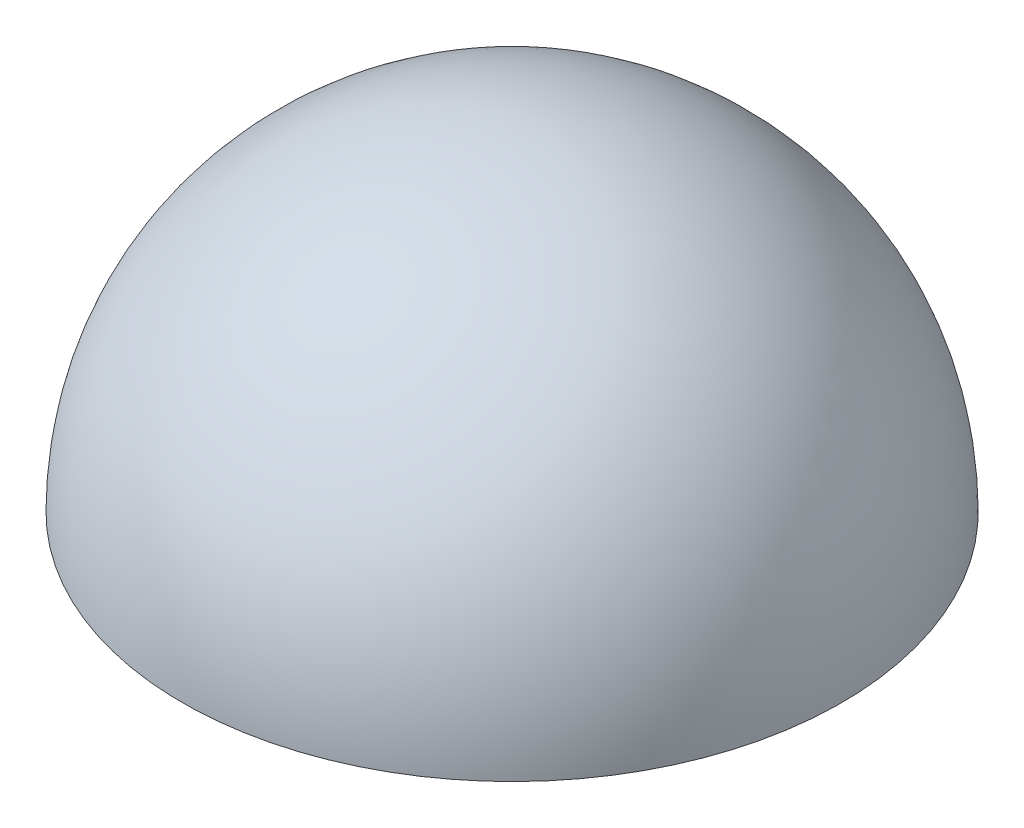
ISO-10303-21;
HEADER;
FILE_DESCRIPTION(('STEP AP214'),'2;1');
FILE_NAME('part.step','',(''),(''),'','','');
FILE_SCHEMA(('AUTOMOTIVE_DESIGN { 1 0 10303 214 1 1 1 1 }'));
ENDSEC;
DATA;
#1=APPLICATION_CONTEXT('core data for automotive mechanical design processes');
#2=APPLICATION_PROTOCOL_DEFINITION('international standard','automotive_design',2000,#1);
#3=PRODUCT_CONTEXT('',#1,'mechanical');
#4=PRODUCT('Part','Part','',(#3));
#5=PRODUCT_RELATED_PRODUCT_CATEGORY('part','',(#4));
#6=PRODUCT_DEFINITION_FORMATION('','',#4);
#7=PRODUCT_DEFINITION_CONTEXT('part definition',#1,'design');
#8=PRODUCT_DEFINITION('design','',#6,#7);
#9=PRODUCT_DEFINITION_SHAPE('','',#8);
#10=(LENGTH_UNIT() NAMED_UNIT(*) SI_UNIT(.MILLI.,.METRE.));
#11=(NAMED_UNIT(*) PLANE_ANGLE_UNIT() SI_UNIT($,.RADIAN.));
#12=(NAMED_UNIT(*) SI_UNIT($,.STERADIAN.) SOLID_ANGLE_UNIT());
#13=UNCERTAINTY_MEASURE_WITH_UNIT(LENGTH_MEASURE(1.E-05),#10,'distance_accuracy_value','');
#14=(GEOMETRIC_REPRESENTATION_CONTEXT(3) GLOBAL_UNCERTAINTY_ASSIGNED_CONTEXT((#13)) GLOBAL_UNIT_ASSIGNED_CONTEXT((#10,
#11,#12)) REPRESENTATION_CONTEXT('',''));
#15=CARTESIAN_POINT('',(0.,0.,0.));
#16=DIRECTION('',(0.,0.,1.));
#17=DIRECTION('',(1.,0.,0.));
#18=AXIS2_PLACEMENT_3D('',#15,#16,#17);
#19=CARTESIAN_POINT('',(0.,0.,47.));
#20=DIRECTION('',(0.,0.,-1.));
#21=DIRECTION('',(-1.,0.,0.));
#22=AXIS2_PLACEMENT_3D('',#19,#20,#21);
#23=SPHERICAL_SURFACE('',#22,47.);
#24=CARTESIAN_POINT('',(0.,0.,47.));
#25=DIRECTION('',(0.,-1.,0.));
#26=DIRECTION('',(0.,0.,-1.));
#27=AXIS2_PLACEMENT_3D('',#24,#25,#26);
#28=SPHERICAL_SURFACE('',#27,47.);
#29=CARTESIAN_POINT('',(0.,0.,47.));
#30=DIRECTION('',(0.,-1.,0.));
#31=DIRECTION('',(0.,0.,-1.));
#32=AXIS2_PLACEMENT_3D('',#29,#30,#31);
#33=CIRCLE('',#32,47.);
#34=CARTESIAN_POINT('',(0.,0.,0.));
#35=VERTEX_POINT('',#34);
#36=EDGE_CURVE('E10',#35,#35,#33,.T.);
#37=ORIENTED_EDGE('',*,*,#36,.F.);
#38=EDGE_LOOP('',(#37));
#39=FACE_BOUND('',#38,.T.);
#40=ADVANCED_FACE('F35',(#39),#28,.T.);
#41=CARTESIAN_POINT('',(0.,0.,47.));
#42=DIRECTION('',(0.,1.,0.));
#43=DIRECTION('',(0.,0.,-1.));
#44=AXIS2_PLACEMENT_3D('',#41,#42,#43);
#45=PLANE('',#44);
#46=CARTESIAN_POINT('',(0.,0.,47.));
#47=DIRECTION('',(0.,1.,0.));
#48=DIRECTION('',(-1.,0.,0.));
#49=AXIS2_PLACEMENT_3D('',#46,#47,#48);
#50=CIRCLE('',#49,44.);
#51=CARTESIAN_POINT('',(-43.9999999999999,-3.07250357818195E-13,47.));
#52=VERTEX_POINT('',#51);
#53=EDGE_CURVE('E41',#52,#52,#50,.F.);
#54=ORIENTED_EDGE('',*,*,#53,.F.);
#55=EDGE_LOOP('',(#54));
#56=FACE_BOUND('',#55,.T.);
#57=ORIENTED_EDGE('',*,*,#36,.T.);
#58=EDGE_LOOP('',(#57));
#59=FACE_BOUND('',#58,.T.);
#60=ADVANCED_FACE('F49',(#56,#59),#45,.F.);
#61=CARTESIAN_POINT('',(0.,0.,47.));
#62=DIRECTION('',(0.,0.,-1.));
#63=DIRECTION('',(-1.,0.,0.));
#64=AXIS2_PLACEMENT_3D('',#61,#62,#63);
#65=SPHERICAL_SURFACE('',#64,44.);
#66=CARTESIAN_POINT('',(0.,0.,47.));
#67=DIRECTION('',(0.,1.,0.));
#68=DIRECTION('',(-1.,0.,0.));
#69=AXIS2_PLACEMENT_3D('',#66,#67,#68);
#70=SPHERICAL_SURFACE('',#69,44.);
#71=ORIENTED_EDGE('',*,*,#53,.T.);
#72=EDGE_LOOP('',(#71));
#73=FACE_BOUND('',#72,.T.);
#74=ADVANCED_FACE('F47',(#73),#70,.F.);
#75=CLOSED_SHELL('',(#40,#60,#74));
#76=MANIFOLD_SOLID_BREP('B2',#75);
#77=ADVANCED_BREP_SHAPE_REPRESENTATION('',(#18,#76),#14);
#78=SHAPE_DEFINITION_REPRESENTATION(#9,#77);
ENDSEC;
END-ISO-10303-21;
